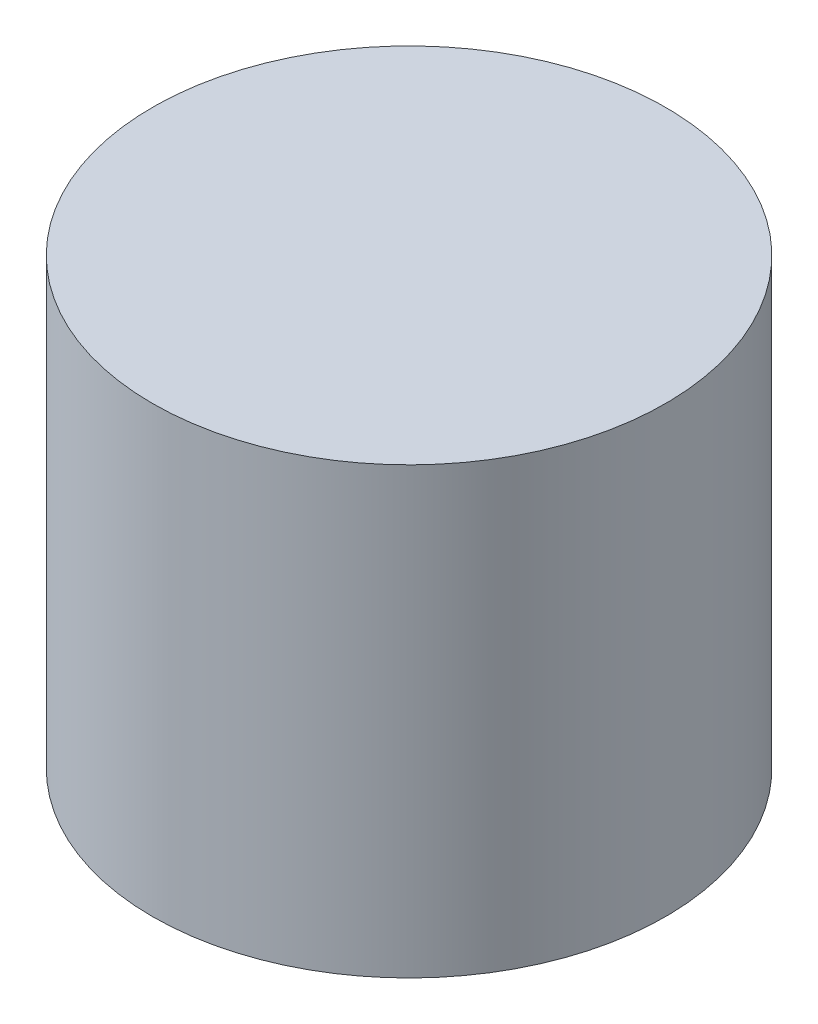
ISO-10303-21;
HEADER;
FILE_DESCRIPTION(('STEP AP214'),'2;1');
FILE_NAME('part.step','',(''),(''),'','','');
FILE_SCHEMA(('AUTOMOTIVE_DESIGN { 1 0 10303 214 1 1 1 1 }'));
ENDSEC;
DATA;
#1=APPLICATION_CONTEXT('core data for automotive mechanical design processes');
#2=APPLICATION_PROTOCOL_DEFINITION('international standard','automotive_design',2000,#1);
#3=PRODUCT_CONTEXT('',#1,'mechanical');
#4=PRODUCT('Part','Part','',(#3));
#5=PRODUCT_RELATED_PRODUCT_CATEGORY('part','',(#4));
#6=PRODUCT_DEFINITION_FORMATION('','',#4);
#7=PRODUCT_DEFINITION_CONTEXT('part definition',#1,'design');
#8=PRODUCT_DEFINITION('design','',#6,#7);
#9=PRODUCT_DEFINITION_SHAPE('','',#8);
#10=(LENGTH_UNIT() NAMED_UNIT(*) SI_UNIT(.MILLI.,.METRE.));
#11=(NAMED_UNIT(*) PLANE_ANGLE_UNIT() SI_UNIT($,.RADIAN.));
#12=(NAMED_UNIT(*) SI_UNIT($,.STERADIAN.) SOLID_ANGLE_UNIT());
#13=UNCERTAINTY_MEASURE_WITH_UNIT(LENGTH_MEASURE(1.E-05),#10,'distance_accuracy_value','');
#14=(GEOMETRIC_REPRESENTATION_CONTEXT(3) GLOBAL_UNCERTAINTY_ASSIGNED_CONTEXT((#13)) GLOBAL_UNIT_ASSIGNED_CONTEXT((#10,
#11,#12)) REPRESENTATION_CONTEXT('',''));
#15=CARTESIAN_POINT('',(0.,0.,0.));
#16=DIRECTION('',(0.,0.,1.));
#17=DIRECTION('',(1.,0.,0.));
#18=AXIS2_PLACEMENT_3D('',#15,#16,#17);
#19=CARTESIAN_POINT('',(0.,11.,0.));
#20=DIRECTION('',(0.,-1.,0.));
#21=DIRECTION('',(0.,0.,-1.));
#22=AXIS2_PLACEMENT_3D('',#19,#20,#21);
#23=CYLINDRICAL_SURFACE('',#22,6.35);
#24=CARTESIAN_POINT('',(0.,11.,0.));
#25=DIRECTION('',(0.,1.,0.));
#26=DIRECTION('',(0.,0.,1.));
#27=AXIS2_PLACEMENT_3D('',#24,#25,#26);
#28=CIRCLE('',#27,6.35);
#29=CARTESIAN_POINT('',(0.,11.,6.35));
#30=VERTEX_POINT('',#29);
#31=EDGE_CURVE('E10',#30,#30,#28,.T.);
#32=ORIENTED_EDGE('',*,*,#31,.F.);
#33=EDGE_LOOP('',(#32));
#34=FACE_BOUND('',#33,.T.);
#35=CARTESIAN_POINT('',(0.,0.,0.));
#36=DIRECTION('',(0.,1.,0.));
#37=DIRECTION('',(0.,0.,1.));
#38=AXIS2_PLACEMENT_3D('',#35,#36,#37);
#39=CIRCLE('',#38,6.35);
#40=CARTESIAN_POINT('',(0.,0.,6.35));
#41=VERTEX_POINT('',#40);
#42=EDGE_CURVE('E36',#41,#41,#39,.T.);
#43=ORIENTED_EDGE('',*,*,#42,.T.);
#44=EDGE_LOOP('',(#43));
#45=FACE_BOUND('',#44,.T.);
#46=ADVANCED_FACE('F33',(#34,#45),#23,.T.);
#47=CARTESIAN_POINT('',(0.,11.,0.));
#48=DIRECTION('',(0.,1.,0.));
#49=DIRECTION('',(0.,0.,1.));
#50=AXIS2_PLACEMENT_3D('',#47,#48,#49);
#51=PLANE('',#50);
#52=ORIENTED_EDGE('',*,*,#31,.T.);
#53=EDGE_LOOP('',(#52));
#54=FACE_BOUND('',#53,.T.);
#55=ADVANCED_FACE('F48',(#54),#51,.T.);
#56=CARTESIAN_POINT('',(0.,0.,0.));
#57=DIRECTION('',(0.,1.,0.));
#58=DIRECTION('',(0.,0.,1.));
#59=AXIS2_PLACEMENT_3D('',#56,#57,#58);
#60=PLANE('',#59);
#61=ORIENTED_EDGE('',*,*,#42,.F.);
#62=EDGE_LOOP('',(#61));
#63=FACE_BOUND('',#62,.T.);
#64=ADVANCED_FACE('F46',(#63),#60,.F.);
#65=CLOSED_SHELL('',(#46,#55,#64));
#66=MANIFOLD_SOLID_BREP('B2',#65);
#67=ADVANCED_BREP_SHAPE_REPRESENTATION('',(#18,#66),#14);
#68=SHAPE_DEFINITION_REPRESENTATION(#9,#67);
ENDSEC;
END-ISO-10303-21;
